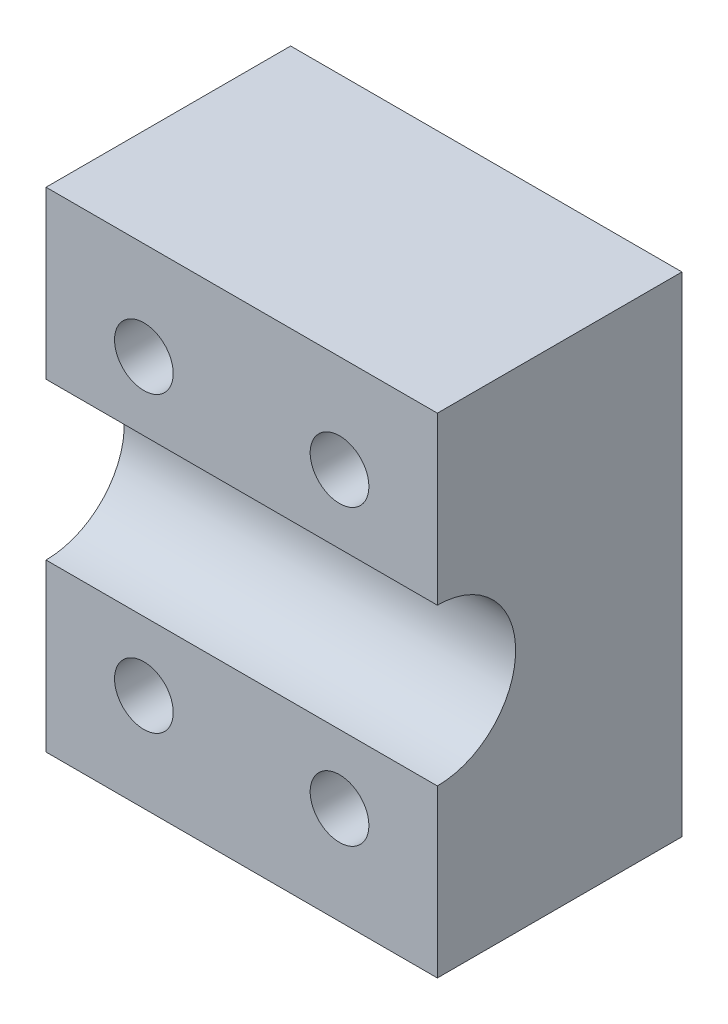
ISO-10303-21;
HEADER;
FILE_DESCRIPTION(('STEP AP214'),'2;1');
FILE_NAME('part.step','',(''),(''),'','','');
FILE_SCHEMA(('AUTOMOTIVE_DESIGN { 1 0 10303 214 1 1 1 1 }'));
ENDSEC;
DATA;
#1=APPLICATION_CONTEXT('core data for automotive mechanical design processes');
#2=APPLICATION_PROTOCOL_DEFINITION('international standard','automotive_design',2000,#1);
#3=PRODUCT_CONTEXT('',#1,'mechanical');
#4=PRODUCT('Part','Part','',(#3));
#5=PRODUCT_RELATED_PRODUCT_CATEGORY('part','',(#4));
#6=PRODUCT_DEFINITION_FORMATION('','',#4);
#7=PRODUCT_DEFINITION_CONTEXT('part definition',#1,'design');
#8=PRODUCT_DEFINITION('design','',#6,#7);
#9=PRODUCT_DEFINITION_SHAPE('','',#8);
#10=(LENGTH_UNIT() NAMED_UNIT(*) SI_UNIT(.MILLI.,.METRE.));
#11=(NAMED_UNIT(*) PLANE_ANGLE_UNIT() SI_UNIT($,.RADIAN.));
#12=(NAMED_UNIT(*) SI_UNIT($,.STERADIAN.) SOLID_ANGLE_UNIT());
#13=UNCERTAINTY_MEASURE_WITH_UNIT(LENGTH_MEASURE(1.E-05),#10,'distance_accuracy_value','');
#14=(GEOMETRIC_REPRESENTATION_CONTEXT(3) GLOBAL_UNCERTAINTY_ASSIGNED_CONTEXT((#13)) GLOBAL_UNIT_ASSIGNED_CONTEXT((#10,
#11,#12)) REPRESENTATION_CONTEXT('',''));
#15=CARTESIAN_POINT('',(0.,0.,0.));
#16=DIRECTION('',(0.,0.,1.));
#17=DIRECTION('',(1.,0.,0.));
#18=AXIS2_PLACEMENT_3D('',#15,#16,#17);
#19=CARTESIAN_POINT('',(0.,0.,25.));
#20=DIRECTION('',(0.,0.,-1.));
#21=DIRECTION('',(-1.,0.,0.));
#22=AXIS2_PLACEMENT_3D('',#19,#20,#21);
#23=PLANE('',#22);
#24=CARTESIAN_POINT('',(30.,10.,25.));
#25=DIRECTION('',(0.,0.,1.));
#26=DIRECTION('',(1.,0.,0.));
#27=AXIS2_PLACEMENT_3D('',#24,#25,#26);
#28=CIRCLE('',#27,3.);
#29=CARTESIAN_POINT('',(33.,10.,25.));
#30=VERTEX_POINT('',#29);
#31=EDGE_CURVE('E191',#30,#30,#28,.T.);
#32=ORIENTED_EDGE('',*,*,#31,.F.);
#33=EDGE_LOOP('',(#32));
#34=FACE_BOUND('',#33,.T.);
#35=CARTESIAN_POINT('',(10.,10.,25.));
#36=DIRECTION('',(0.,0.,1.));
#37=DIRECTION('',(1.,0.,0.));
#38=AXIS2_PLACEMENT_3D('',#35,#36,#37);
#39=CIRCLE('',#38,3.);
#40=CARTESIAN_POINT('',(13.,10.,25.));
#41=VERTEX_POINT('',#40);
#42=EDGE_CURVE('E187',#41,#41,#39,.T.);
#43=ORIENTED_EDGE('',*,*,#42,.F.);
#44=EDGE_LOOP('',(#43));
#45=FACE_BOUND('',#44,.T.);
#46=DIRECTION('',(0.,1.,0.));
#47=VECTOR('',#46,1.);
#48=CARTESIAN_POINT('',(40.,0.,25.));
#49=LINE('',#48,#47);
#50=CARTESIAN_POINT('',(40.,0.,25.));
#51=VERTEX_POINT('',#50);
#52=CARTESIAN_POINT('',(40.,17.,25.));
#53=VERTEX_POINT('',#52);
#54=EDGE_CURVE('E110',#51,#53,#49,.T.);
#55=ORIENTED_EDGE('',*,*,#54,.T.);
#56=DIRECTION('',(-1.,0.,0.));
#57=VECTOR('',#56,1.);
#58=CARTESIAN_POINT('',(58.,17.,25.));
#59=LINE('',#58,#57);
#60=CARTESIAN_POINT('',(0.,17.,25.));
#61=VERTEX_POINT('',#60);
#62=EDGE_CURVE('E11',#53,#61,#59,.T.);
#63=ORIENTED_EDGE('',*,*,#62,.T.);
#64=DIRECTION('',(0.,-1.,0.));
#65=VECTOR('',#64,1.);
#66=CARTESIAN_POINT('',(0.,0.,25.));
#67=LINE('',#66,#65);
#68=CARTESIAN_POINT('',(0.,0.,25.));
#69=VERTEX_POINT('',#68);
#70=EDGE_CURVE('E84',#61,#69,#67,.T.);
#71=ORIENTED_EDGE('',*,*,#70,.T.);
#72=DIRECTION('',(1.,0.,0.));
#73=VECTOR('',#72,1.);
#74=CARTESIAN_POINT('',(0.,0.,25.));
#75=LINE('',#74,#73);
#76=EDGE_CURVE('E104',#69,#51,#75,.T.);
#77=ORIENTED_EDGE('',*,*,#76,.T.);
#78=EDGE_LOOP('',(#55,#63,#71,#77));
#79=FACE_BOUND('',#78,.T.);
#80=ADVANCED_FACE('F32',(#34,#45,#79),#23,.F.);
#81=CARTESIAN_POINT('',(0.,0.,25.));
#82=DIRECTION('',(1.,0.,0.));
#83=DIRECTION('',(0.,0.,-1.));
#84=AXIS2_PLACEMENT_3D('',#81,#82,#83);
#85=PLANE('',#84);
#86=ORIENTED_EDGE('',*,*,#70,.F.);
#87=CARTESIAN_POINT('',(0.,25.,25.));
#88=DIRECTION('',(-1.,0.,0.));
#89=DIRECTION('',(0.,0.,1.));
#90=AXIS2_PLACEMENT_3D('',#87,#88,#89);
#91=CIRCLE('',#90,8.);
#92=CARTESIAN_POINT('',(0.,33.,25.));
#93=VERTEX_POINT('',#92);
#94=EDGE_CURVE('E94',#93,#61,#91,.T.);
#95=ORIENTED_EDGE('',*,*,#94,.F.);
#96=CARTESIAN_POINT('',(0.,50.,25.));
#97=VERTEX_POINT('',#96);
#98=EDGE_CURVE('E99',#97,#93,#67,.T.);
#99=ORIENTED_EDGE('',*,*,#98,.F.);
#100=DIRECTION('',(0.,0.,-1.));
#101=VECTOR('',#100,1.);
#102=CARTESIAN_POINT('',(0.,50.,25.));
#103=LINE('',#102,#101);
#104=CARTESIAN_POINT('',(0.,50.,0.));
#105=VERTEX_POINT('',#104);
#106=EDGE_CURVE('E114',#97,#105,#103,.T.);
#107=ORIENTED_EDGE('',*,*,#106,.T.);
#108=DIRECTION('',(0.,-1.,0.));
#109=VECTOR('',#108,1.);
#110=CARTESIAN_POINT('',(0.,0.,0.));
#111=LINE('',#110,#109);
#112=CARTESIAN_POINT('',(0.,0.,0.));
#113=VERTEX_POINT('',#112);
#114=EDGE_CURVE('E115',#105,#113,#111,.T.);
#115=ORIENTED_EDGE('',*,*,#114,.T.);
#116=DIRECTION('',(0.,0.,-1.));
#117=VECTOR('',#116,1.);
#118=CARTESIAN_POINT('',(0.,0.,25.));
#119=LINE('',#118,#117);
#120=EDGE_CURVE('E96',#69,#113,#119,.T.);
#121=ORIENTED_EDGE('',*,*,#120,.F.);
#122=EDGE_LOOP('',(#86,#95,#99,#107,#115,#121));
#123=FACE_BOUND('',#122,.T.);
#124=ADVANCED_FACE('F34',(#123),#85,.F.);
#125=CARTESIAN_POINT('',(0.,0.,25.));
#126=DIRECTION('',(0.,1.,0.));
#127=DIRECTION('',(0.,0.,1.));
#128=AXIS2_PLACEMENT_3D('',#125,#126,#127);
#129=PLANE('',#128);
#130=DIRECTION('',(1.,0.,0.));
#131=VECTOR('',#130,1.);
#132=CARTESIAN_POINT('',(0.,0.,0.));
#133=LINE('',#132,#131);
#134=CARTESIAN_POINT('',(40.,0.,0.));
#135=VERTEX_POINT('',#134);
#136=EDGE_CURVE('E118',#113,#135,#133,.T.);
#137=ORIENTED_EDGE('',*,*,#136,.T.);
#138=DIRECTION('',(0.,0.,-1.));
#139=VECTOR('',#138,1.);
#140=CARTESIAN_POINT('',(40.,0.,25.));
#141=LINE('',#140,#139);
#142=EDGE_CURVE('E126',#51,#135,#141,.T.);
#143=ORIENTED_EDGE('',*,*,#142,.F.);
#144=ORIENTED_EDGE('',*,*,#76,.F.);
#145=ORIENTED_EDGE('',*,*,#120,.T.);
#146=EDGE_LOOP('',(#137,#143,#144,#145));
#147=FACE_BOUND('',#146,.T.);
#148=ADVANCED_FACE('F131',(#147),#129,.F.);
#149=CARTESIAN_POINT('',(40.,0.,25.));
#150=DIRECTION('',(-1.,0.,0.));
#151=DIRECTION('',(0.,0.,1.));
#152=AXIS2_PLACEMENT_3D('',#149,#150,#151);
#153=PLANE('',#152);
#154=CARTESIAN_POINT('',(40.,33.,25.));
#155=VERTEX_POINT('',#154);
#156=CARTESIAN_POINT('',(40.,50.,25.));
#157=VERTEX_POINT('',#156);
#158=EDGE_CURVE('E106',#155,#157,#49,.T.);
#159=ORIENTED_EDGE('',*,*,#158,.F.);
#160=CARTESIAN_POINT('',(40.,25.,25.));
#161=DIRECTION('',(-1.,0.,0.));
#162=DIRECTION('',(0.,0.,1.));
#163=AXIS2_PLACEMENT_3D('',#160,#161,#162);
#164=CIRCLE('',#163,8.);
#165=EDGE_CURVE('E47',#155,#53,#164,.T.);
#166=ORIENTED_EDGE('',*,*,#165,.T.);
#167=ORIENTED_EDGE('',*,*,#54,.F.);
#168=ORIENTED_EDGE('',*,*,#142,.T.);
#169=DIRECTION('',(0.,1.,0.));
#170=VECTOR('',#169,1.);
#171=CARTESIAN_POINT('',(40.,0.,0.));
#172=LINE('',#171,#170);
#173=CARTESIAN_POINT('',(40.,50.,0.));
#174=VERTEX_POINT('',#173);
#175=EDGE_CURVE('E120',#135,#174,#172,.T.);
#176=ORIENTED_EDGE('',*,*,#175,.T.);
#177=DIRECTION('',(0.,0.,-1.));
#178=VECTOR('',#177,1.);
#179=CARTESIAN_POINT('',(40.,50.,25.));
#180=LINE('',#179,#178);
#181=EDGE_CURVE('E124',#157,#174,#180,.T.);
#182=ORIENTED_EDGE('',*,*,#181,.F.);
#183=EDGE_LOOP('',(#159,#166,#167,#168,#176,#182));
#184=FACE_BOUND('',#183,.T.);
#185=ADVANCED_FACE('F139',(#184),#153,.F.);
#186=CARTESIAN_POINT('',(0.,50.,25.));
#187=DIRECTION('',(0.,-1.,0.));
#188=DIRECTION('',(0.,0.,-1.));
#189=AXIS2_PLACEMENT_3D('',#186,#187,#188);
#190=PLANE('',#189);
#191=DIRECTION('',(-1.,0.,0.));
#192=VECTOR('',#191,1.);
#193=CARTESIAN_POINT('',(0.,50.,0.));
#194=LINE('',#193,#192);
#195=EDGE_CURVE('E77',#174,#105,#194,.T.);
#196=ORIENTED_EDGE('',*,*,#195,.T.);
#197=ORIENTED_EDGE('',*,*,#106,.F.);
#198=DIRECTION('',(-1.,0.,0.));
#199=VECTOR('',#198,1.);
#200=CARTESIAN_POINT('',(0.,50.,25.));
#201=LINE('',#200,#199);
#202=EDGE_CURVE('E56',#157,#97,#201,.T.);
#203=ORIENTED_EDGE('',*,*,#202,.F.);
#204=ORIENTED_EDGE('',*,*,#181,.T.);
#205=EDGE_LOOP('',(#196,#197,#203,#204));
#206=FACE_BOUND('',#205,.T.);
#207=ADVANCED_FACE('F141',(#206),#190,.F.);
#208=CARTESIAN_POINT('',(30.,40.,25.));
#209=DIRECTION('',(0.,0.,1.));
#210=DIRECTION('',(1.,0.,0.));
#211=AXIS2_PLACEMENT_3D('',#208,#209,#210);
#212=CIRCLE('',#211,3.);
#213=CARTESIAN_POINT('',(33.,40.,25.));
#214=VERTEX_POINT('',#213);
#215=EDGE_CURVE('E195',#214,#214,#212,.T.);
#216=ORIENTED_EDGE('',*,*,#215,.F.);
#217=EDGE_LOOP('',(#216));
#218=FACE_BOUND('',#217,.T.);
#219=CARTESIAN_POINT('',(10.,40.,25.));
#220=DIRECTION('',(0.,0.,1.));
#221=DIRECTION('',(1.,0.,0.));
#222=AXIS2_PLACEMENT_3D('',#219,#220,#221);
#223=CIRCLE('',#222,3.);
#224=CARTESIAN_POINT('',(13.,40.,25.));
#225=VERTEX_POINT('',#224);
#226=EDGE_CURVE('E182',#225,#225,#223,.T.);
#227=ORIENTED_EDGE('',*,*,#226,.F.);
#228=EDGE_LOOP('',(#227));
#229=FACE_BOUND('',#228,.T.);
#230=ORIENTED_EDGE('',*,*,#98,.T.);
#231=DIRECTION('',(-1.,0.,0.));
#232=VECTOR('',#231,1.);
#233=CARTESIAN_POINT('',(58.,33.,25.));
#234=LINE('',#233,#232);
#235=EDGE_CURVE('E40',#93,#155,#234,.F.);
#236=ORIENTED_EDGE('',*,*,#235,.T.);
#237=ORIENTED_EDGE('',*,*,#158,.T.);
#238=ORIENTED_EDGE('',*,*,#202,.T.);
#239=EDGE_LOOP('',(#230,#236,#237,#238));
#240=FACE_BOUND('',#239,.T.);
#241=ADVANCED_FACE('F103',(#218,#229,#240),#23,.F.);
#242=CARTESIAN_POINT('',(0.,0.,0.));
#243=DIRECTION('',(0.,0.,-1.));
#244=DIRECTION('',(-1.,0.,0.));
#245=AXIS2_PLACEMENT_3D('',#242,#243,#244);
#246=PLANE('',#245);
#247=CARTESIAN_POINT('',(30.,40.,0.));
#248=DIRECTION('',(0.,0.,1.));
#249=DIRECTION('',(1.,0.,0.));
#250=AXIS2_PLACEMENT_3D('',#247,#248,#249);
#251=CIRCLE('',#250,3.);
#252=CARTESIAN_POINT('',(33.,40.,0.));
#253=VERTEX_POINT('',#252);
#254=EDGE_CURVE('E170',#253,#253,#251,.T.);
#255=ORIENTED_EDGE('',*,*,#254,.T.);
#256=EDGE_LOOP('',(#255));
#257=FACE_BOUND('',#256,.T.);
#258=CARTESIAN_POINT('',(30.,10.,0.));
#259=DIRECTION('',(0.,0.,1.));
#260=DIRECTION('',(1.,0.,0.));
#261=AXIS2_PLACEMENT_3D('',#258,#259,#260);
#262=CIRCLE('',#261,3.);
#263=CARTESIAN_POINT('',(33.,10.,0.));
#264=VERTEX_POINT('',#263);
#265=EDGE_CURVE('E174',#264,#264,#262,.T.);
#266=ORIENTED_EDGE('',*,*,#265,.T.);
#267=EDGE_LOOP('',(#266));
#268=FACE_BOUND('',#267,.T.);
#269=CARTESIAN_POINT('',(10.,10.,0.));
#270=DIRECTION('',(0.,0.,1.));
#271=DIRECTION('',(1.,0.,0.));
#272=AXIS2_PLACEMENT_3D('',#269,#270,#271);
#273=CIRCLE('',#272,3.);
#274=CARTESIAN_POINT('',(13.,10.,0.));
#275=VERTEX_POINT('',#274);
#276=EDGE_CURVE('E178',#275,#275,#273,.T.);
#277=ORIENTED_EDGE('',*,*,#276,.T.);
#278=EDGE_LOOP('',(#277));
#279=FACE_BOUND('',#278,.T.);
#280=CARTESIAN_POINT('',(10.,40.,0.));
#281=DIRECTION('',(0.,0.,1.));
#282=DIRECTION('',(1.,0.,0.));
#283=AXIS2_PLACEMENT_3D('',#280,#281,#282);
#284=CIRCLE('',#283,3.);
#285=CARTESIAN_POINT('',(13.,40.,0.));
#286=VERTEX_POINT('',#285);
#287=EDGE_CURVE('E101',#286,#286,#284,.T.);
#288=ORIENTED_EDGE('',*,*,#287,.T.);
#289=EDGE_LOOP('',(#288));
#290=FACE_BOUND('',#289,.T.);
#291=ORIENTED_EDGE('',*,*,#114,.F.);
#292=ORIENTED_EDGE('',*,*,#195,.F.);
#293=ORIENTED_EDGE('',*,*,#175,.F.);
#294=ORIENTED_EDGE('',*,*,#136,.F.);
#295=EDGE_LOOP('',(#291,#292,#293,#294));
#296=FACE_BOUND('',#295,.T.);
#297=ADVANCED_FACE('F135',(#257,#268,#279,#290,#296),#246,.T.);
#298=CARTESIAN_POINT('',(58.,25.,25.));
#299=DIRECTION('',(-1.,0.,0.));
#300=DIRECTION('',(0.,0.,1.));
#301=AXIS2_PLACEMENT_3D('',#298,#299,#300);
#302=CYLINDRICAL_SURFACE('',#301,8.);
#303=ORIENTED_EDGE('',*,*,#165,.F.);
#304=ORIENTED_EDGE('',*,*,#235,.F.);
#305=ORIENTED_EDGE('',*,*,#94,.T.);
#306=ORIENTED_EDGE('',*,*,#62,.F.);
#307=EDGE_LOOP('',(#303,#304,#305,#306));
#308=FACE_BOUND('',#307,.T.);
#309=ADVANCED_FACE('F93',(#308),#302,.F.);
#310=CARTESIAN_POINT('',(10.,40.,0.));
#311=DIRECTION('',(0.,0.,1.));
#312=DIRECTION('',(1.,0.,0.));
#313=AXIS2_PLACEMENT_3D('',#310,#311,#312);
#314=CYLINDRICAL_SURFACE('',#313,3.);
#315=ORIENTED_EDGE('',*,*,#287,.F.);
#316=EDGE_LOOP('',(#315));
#317=FACE_BOUND('',#316,.T.);
#318=ORIENTED_EDGE('',*,*,#226,.T.);
#319=EDGE_LOOP('',(#318));
#320=FACE_BOUND('',#319,.T.);
#321=ADVANCED_FACE('F166',(#317,#320),#314,.F.);
#322=CARTESIAN_POINT('',(10.,10.,0.));
#323=DIRECTION('',(0.,0.,1.));
#324=DIRECTION('',(1.,0.,0.));
#325=AXIS2_PLACEMENT_3D('',#322,#323,#324);
#326=CYLINDRICAL_SURFACE('',#325,3.);
#327=ORIENTED_EDGE('',*,*,#276,.F.);
#328=EDGE_LOOP('',(#327));
#329=FACE_BOUND('',#328,.T.);
#330=ORIENTED_EDGE('',*,*,#42,.T.);
#331=EDGE_LOOP('',(#330));
#332=FACE_BOUND('',#331,.T.);
#333=ADVANCED_FACE('F205',(#329,#332),#326,.F.);
#334=CARTESIAN_POINT('',(30.,10.,0.));
#335=DIRECTION('',(0.,0.,1.));
#336=DIRECTION('',(1.,0.,0.));
#337=AXIS2_PLACEMENT_3D('',#334,#335,#336);
#338=CYLINDRICAL_SURFACE('',#337,3.);
#339=ORIENTED_EDGE('',*,*,#265,.F.);
#340=EDGE_LOOP('',(#339));
#341=FACE_BOUND('',#340,.T.);
#342=ORIENTED_EDGE('',*,*,#31,.T.);
#343=EDGE_LOOP('',(#342));
#344=FACE_BOUND('',#343,.T.);
#345=ADVANCED_FACE('F209',(#341,#344),#338,.F.);
#346=CARTESIAN_POINT('',(30.,40.,0.));
#347=DIRECTION('',(0.,0.,1.));
#348=DIRECTION('',(1.,0.,0.));
#349=AXIS2_PLACEMENT_3D('',#346,#347,#348);
#350=CYLINDRICAL_SURFACE('',#349,3.);
#351=ORIENTED_EDGE('',*,*,#254,.F.);
#352=EDGE_LOOP('',(#351));
#353=FACE_BOUND('',#352,.T.);
#354=ORIENTED_EDGE('',*,*,#215,.T.);
#355=EDGE_LOOP('',(#354));
#356=FACE_BOUND('',#355,.T.);
#357=ADVANCED_FACE('F200',(#353,#356),#350,.F.);
#358=CLOSED_SHELL('',(#80,#124,#148,#185,#207,#241,#297,#309,#321,#333,#345,#357));
#359=MANIFOLD_SOLID_BREP('B2',#358);
#360=ADVANCED_BREP_SHAPE_REPRESENTATION('',(#18,#359),#14);
#361=SHAPE_DEFINITION_REPRESENTATION(#9,#360);
ENDSEC;
END-ISO-10303-21;
